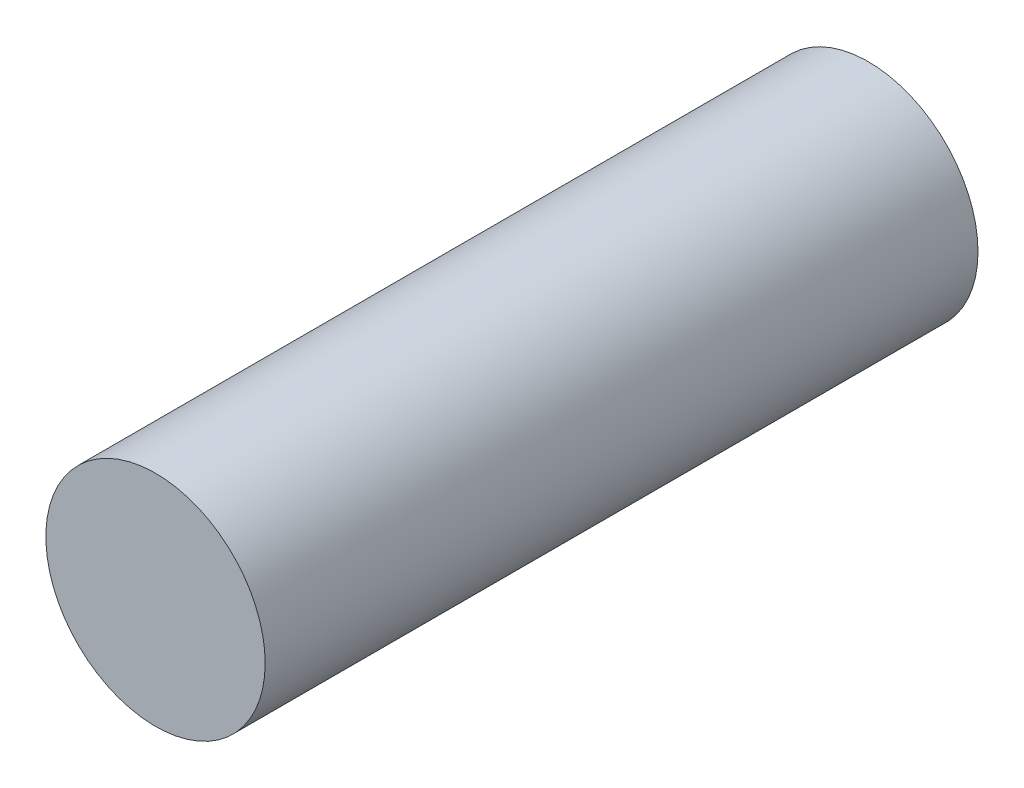
ISO-10303-21;
HEADER;
FILE_DESCRIPTION(('STEP AP214'),'2;1');
FILE_NAME('part.step','',(''),(''),'','','');
FILE_SCHEMA(('AUTOMOTIVE_DESIGN { 1 0 10303 214 1 1 1 1 }'));
ENDSEC;
DATA;
#1=APPLICATION_CONTEXT('core data for automotive mechanical design processes');
#2=APPLICATION_PROTOCOL_DEFINITION('international standard','automotive_design',2000,#1);
#3=PRODUCT_CONTEXT('',#1,'mechanical');
#4=PRODUCT('Part','Part','',(#3));
#5=PRODUCT_RELATED_PRODUCT_CATEGORY('part','',(#4));
#6=PRODUCT_DEFINITION_FORMATION('','',#4);
#7=PRODUCT_DEFINITION_CONTEXT('part definition',#1,'design');
#8=PRODUCT_DEFINITION('design','',#6,#7);
#9=PRODUCT_DEFINITION_SHAPE('','',#8);
#10=(LENGTH_UNIT() NAMED_UNIT(*) SI_UNIT(.MILLI.,.METRE.));
#11=(NAMED_UNIT(*) PLANE_ANGLE_UNIT() SI_UNIT($,.RADIAN.));
#12=(NAMED_UNIT(*) SI_UNIT($,.STERADIAN.) SOLID_ANGLE_UNIT());
#13=UNCERTAINTY_MEASURE_WITH_UNIT(LENGTH_MEASURE(1.E-05),#10,'distance_accuracy_value','');
#14=(GEOMETRIC_REPRESENTATION_CONTEXT(3) GLOBAL_UNCERTAINTY_ASSIGNED_CONTEXT((#13)) GLOBAL_UNIT_ASSIGNED_CONTEXT((#10,
#11,#12)) REPRESENTATION_CONTEXT('',''));
#15=CARTESIAN_POINT('',(0.,0.,0.));
#16=DIRECTION('',(0.,0.,1.));
#17=DIRECTION('',(1.,0.,0.));
#18=AXIS2_PLACEMENT_3D('',#15,#16,#17);
#19=CARTESIAN_POINT('',(0.,0.,65.));
#20=DIRECTION('',(0.,0.,-1.));
#21=DIRECTION('',(-1.,0.,0.));
#22=AXIS2_PLACEMENT_3D('',#19,#20,#21);
#23=CYLINDRICAL_SURFACE('',#22,10.);
#24=CARTESIAN_POINT('',(0.,0.,65.));
#25=DIRECTION('',(0.,0.,1.));
#26=DIRECTION('',(1.,0.,0.));
#27=AXIS2_PLACEMENT_3D('',#24,#25,#26);
#28=CIRCLE('',#27,10.);
#29=CARTESIAN_POINT('',(10.,0.,65.));
#30=VERTEX_POINT('',#29);
#31=EDGE_CURVE('E10',#30,#30,#28,.T.);
#32=ORIENTED_EDGE('',*,*,#31,.F.);
#33=EDGE_LOOP('',(#32));
#34=FACE_BOUND('',#33,.T.);
#35=CARTESIAN_POINT('',(0.,0.,0.));
#36=DIRECTION('',(0.,0.,1.));
#37=DIRECTION('',(1.,0.,0.));
#38=AXIS2_PLACEMENT_3D('',#35,#36,#37);
#39=CIRCLE('',#38,10.);
#40=CARTESIAN_POINT('',(10.,0.,0.));
#41=VERTEX_POINT('',#40);
#42=EDGE_CURVE('E36',#41,#41,#39,.T.);
#43=ORIENTED_EDGE('',*,*,#42,.T.);
#44=EDGE_LOOP('',(#43));
#45=FACE_BOUND('',#44,.T.);
#46=ADVANCED_FACE('F33',(#34,#45),#23,.T.);
#47=CARTESIAN_POINT('',(0.,0.,65.));
#48=DIRECTION('',(0.,0.,1.));
#49=DIRECTION('',(1.,0.,0.));
#50=AXIS2_PLACEMENT_3D('',#47,#48,#49);
#51=PLANE('',#50);
#52=ORIENTED_EDGE('',*,*,#31,.T.);
#53=EDGE_LOOP('',(#52));
#54=FACE_BOUND('',#53,.T.);
#55=ADVANCED_FACE('F48',(#54),#51,.T.);
#56=CARTESIAN_POINT('',(0.,0.,0.));
#57=DIRECTION('',(0.,0.,1.));
#58=DIRECTION('',(1.,0.,0.));
#59=AXIS2_PLACEMENT_3D('',#56,#57,#58);
#60=PLANE('',#59);
#61=ORIENTED_EDGE('',*,*,#42,.F.);
#62=EDGE_LOOP('',(#61));
#63=FACE_BOUND('',#62,.T.);
#64=ADVANCED_FACE('F46',(#63),#60,.F.);
#65=CLOSED_SHELL('',(#46,#55,#64));
#66=MANIFOLD_SOLID_BREP('B2',#65);
#67=ADVANCED_BREP_SHAPE_REPRESENTATION('',(#18,#66),#14);
#68=SHAPE_DEFINITION_REPRESENTATION(#9,#67);
ENDSEC;
END-ISO-10303-21;
